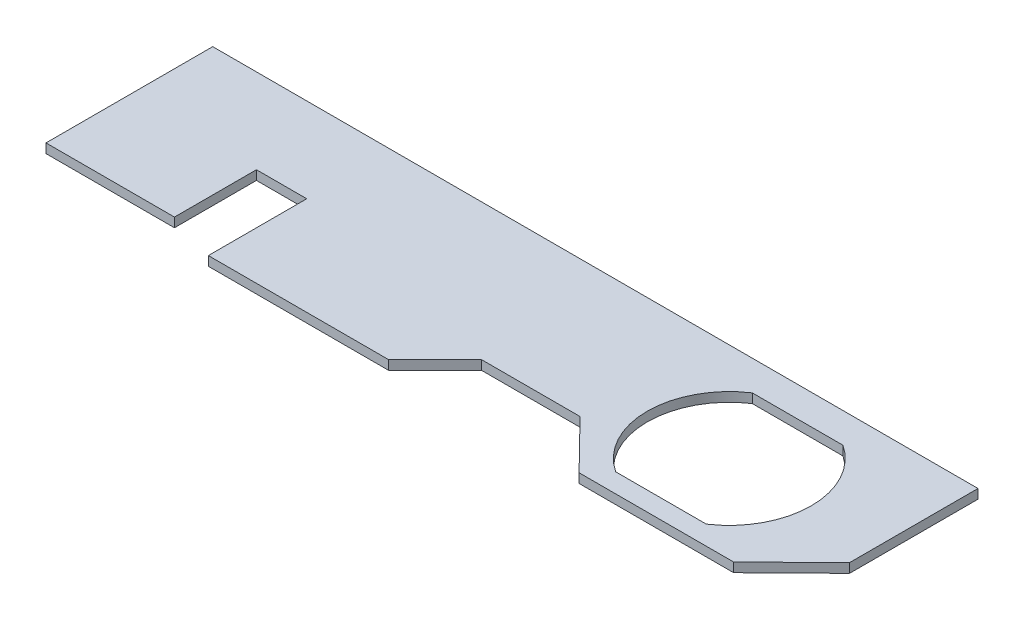
ISO-10303-21;
HEADER;
FILE_DESCRIPTION(('STEP AP214'),'2;1');
FILE_NAME('part.step','',(''),(''),'','','');
FILE_SCHEMA(('AUTOMOTIVE_DESIGN { 1 0 10303 214 1 1 1 1 }'));
ENDSEC;
DATA;
#1=APPLICATION_CONTEXT('core data for automotive mechanical design processes');
#2=APPLICATION_PROTOCOL_DEFINITION('international standard','automotive_design',2000,#1);
#3=PRODUCT_CONTEXT('',#1,'mechanical');
#4=PRODUCT('Part','Part','',(#3));
#5=PRODUCT_RELATED_PRODUCT_CATEGORY('part','',(#4));
#6=PRODUCT_DEFINITION_FORMATION('','',#4);
#7=PRODUCT_DEFINITION_CONTEXT('part definition',#1,'design');
#8=PRODUCT_DEFINITION('design','',#6,#7);
#9=PRODUCT_DEFINITION_SHAPE('','',#8);
#10=(LENGTH_UNIT() NAMED_UNIT(*) SI_UNIT(.MILLI.,.METRE.));
#11=(NAMED_UNIT(*) PLANE_ANGLE_UNIT() SI_UNIT($,.RADIAN.));
#12=(NAMED_UNIT(*) SI_UNIT($,.STERADIAN.) SOLID_ANGLE_UNIT());
#13=UNCERTAINTY_MEASURE_WITH_UNIT(LENGTH_MEASURE(1.E-05),#10,'distance_accuracy_value','');
#14=(GEOMETRIC_REPRESENTATION_CONTEXT(3) GLOBAL_UNCERTAINTY_ASSIGNED_CONTEXT((#13)) GLOBAL_UNIT_ASSIGNED_CONTEXT((#10,
#11,#12)) REPRESENTATION_CONTEXT('',''));
#15=CARTESIAN_POINT('',(0.,0.,0.));
#16=DIRECTION('',(0.,0.,1.));
#17=DIRECTION('',(1.,0.,0.));
#18=AXIS2_PLACEMENT_3D('',#15,#16,#17);
#19=CARTESIAN_POINT('',(-8.01792836277165,1.7,0.));
#20=DIRECTION('',(-1.,0.,0.));
#21=DIRECTION('',(0.,0.,1.));
#22=AXIS2_PLACEMENT_3D('',#19,#20,#21);
#23=PLANE('',#22);
#24=DIRECTION('',(0.,0.,-1.));
#25=VECTOR('',#24,1.);
#26=CARTESIAN_POINT('',(-8.01792836277165,0.,0.));
#27=LINE('',#26,#25);
#28=CARTESIAN_POINT('',(-8.01792836277165,0.,16.5546116504854));
#29=VERTEX_POINT('',#28);
#30=CARTESIAN_POINT('',(-8.01792836277165,0.,1.55461165048544));
#31=VERTEX_POINT('',#30);
#32=EDGE_CURVE('E240',#29,#31,#27,.T.);
#33=ORIENTED_EDGE('',*,*,#32,.T.);
#34=DIRECTION('',(0.,-1.,0.));
#35=VECTOR('',#34,1.);
#36=CARTESIAN_POINT('',(-8.01792836277165,1.7,1.55461165048544));
#37=LINE('',#36,#35);
#38=CARTESIAN_POINT('',(-8.01792836277165,1.7,1.55461165048544));
#39=VERTEX_POINT('',#38);
#40=EDGE_CURVE('E11',#39,#31,#37,.T.);
#41=ORIENTED_EDGE('',*,*,#40,.F.);
#42=DIRECTION('',(0.,0.,-1.));
#43=VECTOR('',#42,1.);
#44=CARTESIAN_POINT('',(-8.01792836277165,1.7,0.));
#45=LINE('',#44,#43);
#46=CARTESIAN_POINT('',(-8.01792836277165,1.7,16.5546116504854));
#47=VERTEX_POINT('',#46);
#48=EDGE_CURVE('E343',#47,#39,#45,.T.);
#49=ORIENTED_EDGE('',*,*,#48,.F.);
#50=DIRECTION('',(0.,-1.,0.));
#51=VECTOR('',#50,1.);
#52=CARTESIAN_POINT('',(-8.01792836277165,1.7,16.5546116504854));
#53=LINE('',#52,#51);
#54=EDGE_CURVE('E276',#47,#29,#53,.T.);
#55=ORIENTED_EDGE('',*,*,#54,.T.);
#56=EDGE_LOOP('',(#33,#41,#49,#55));
#57=FACE_BOUND('',#56,.T.);
#58=ADVANCED_FACE('F43',(#57),#23,.F.);
#59=CARTESIAN_POINT('',(0.,1.7,1.55461165048544));
#60=DIRECTION('',(0.,0.,-1.));
#61=DIRECTION('',(-1.,0.,0.));
#62=AXIS2_PLACEMENT_3D('',#59,#60,#61);
#63=PLANE('',#62);
#64=DIRECTION('',(1.,0.,0.));
#65=VECTOR('',#64,1.);
#66=CARTESIAN_POINT('',(0.,0.,1.55461165048544));
#67=LINE('',#66,#65);
#68=CARTESIAN_POINT('',(1.18207163722835,0.,1.55461165048544));
#69=VERTEX_POINT('',#68);
#70=EDGE_CURVE('E244',#31,#69,#67,.T.);
#71=ORIENTED_EDGE('',*,*,#70,.T.);
#72=DIRECTION('',(0.,-1.,0.));
#73=VECTOR('',#72,1.);
#74=CARTESIAN_POINT('',(1.18207163722835,1.7,1.55461165048544));
#75=LINE('',#74,#73);
#76=CARTESIAN_POINT('',(1.18207163722835,1.7,1.55461165048544));
#77=VERTEX_POINT('',#76);
#78=EDGE_CURVE('E53',#77,#69,#75,.T.);
#79=ORIENTED_EDGE('',*,*,#78,.F.);
#80=DIRECTION('',(1.,0.,0.));
#81=VECTOR('',#80,1.);
#82=CARTESIAN_POINT('',(0.,1.7,1.55461165048544));
#83=LINE('',#82,#81);
#84=EDGE_CURVE('E352',#39,#77,#83,.T.);
#85=ORIENTED_EDGE('',*,*,#84,.F.);
#86=ORIENTED_EDGE('',*,*,#40,.T.);
#87=EDGE_LOOP('',(#71,#79,#85,#86));
#88=FACE_BOUND('',#87,.T.);
#89=ADVANCED_FACE('F402',(#88),#63,.F.);
#90=CARTESIAN_POINT('',(1.18207163722835,1.7,0.));
#91=DIRECTION('',(1.,0.,0.));
#92=DIRECTION('',(0.,0.,-1.));
#93=AXIS2_PLACEMENT_3D('',#90,#91,#92);
#94=PLANE('',#93);
#95=DIRECTION('',(0.,0.,1.));
#96=VECTOR('',#95,1.);
#97=CARTESIAN_POINT('',(1.18207163722835,0.,0.));
#98=LINE('',#97,#96);
#99=CARTESIAN_POINT('',(1.18207163722836,0.,19.5546116504854));
#100=VERTEX_POINT('',#99);
#101=EDGE_CURVE('E246',#69,#100,#98,.T.);
#102=ORIENTED_EDGE('',*,*,#101,.T.);
#103=DIRECTION('',(0.,-1.,0.));
#104=VECTOR('',#103,1.);
#105=CARTESIAN_POINT('',(1.18207163722836,1.7,19.5546116504854));
#106=LINE('',#105,#104);
#107=CARTESIAN_POINT('',(1.18207163722836,1.7,19.5546116504854));
#108=VERTEX_POINT('',#107);
#109=EDGE_CURVE('E306',#108,#100,#106,.T.);
#110=ORIENTED_EDGE('',*,*,#109,.F.);
#111=DIRECTION('',(0.,0.,1.));
#112=VECTOR('',#111,1.);
#113=CARTESIAN_POINT('',(1.18207163722835,1.7,0.));
#114=LINE('',#113,#112);
#115=EDGE_CURVE('E354',#77,#108,#114,.T.);
#116=ORIENTED_EDGE('',*,*,#115,.F.);
#117=ORIENTED_EDGE('',*,*,#78,.T.);
#118=EDGE_LOOP('',(#102,#110,#116,#117));
#119=FACE_BOUND('',#118,.T.);
#120=ADVANCED_FACE('F407',(#119),#94,.F.);
#121=CARTESIAN_POINT('',(0.,1.7,19.5546116504854));
#122=DIRECTION('',(0.,0.,-1.));
#123=DIRECTION('',(-1.,0.,0.));
#124=AXIS2_PLACEMENT_3D('',#121,#122,#123);
#125=PLANE('',#124);
#126=DIRECTION('',(1.,0.,0.));
#127=VECTOR('',#126,1.);
#128=CARTESIAN_POINT('',(0.,0.,19.5546116504854));
#129=LINE('',#128,#127);
#130=CARTESIAN_POINT('',(34.1820716372284,0.,19.5546116504854));
#131=VERTEX_POINT('',#130);
#132=EDGE_CURVE('E249',#100,#131,#129,.T.);
#133=ORIENTED_EDGE('',*,*,#132,.T.);
#134=DIRECTION('',(0.,-1.,0.));
#135=VECTOR('',#134,1.);
#136=CARTESIAN_POINT('',(34.1820716372284,1.7,19.5546116504854));
#137=LINE('',#136,#135);
#138=CARTESIAN_POINT('',(34.1820716372284,1.7,19.5546116504854));
#139=VERTEX_POINT('',#138);
#140=EDGE_CURVE('E302',#139,#131,#137,.T.);
#141=ORIENTED_EDGE('',*,*,#140,.F.);
#142=DIRECTION('',(1.,0.,0.));
#143=VECTOR('',#142,1.);
#144=CARTESIAN_POINT('',(0.,1.7,19.5546116504854));
#145=LINE('',#144,#143);
#146=EDGE_CURVE('E357',#108,#139,#145,.T.);
#147=ORIENTED_EDGE('',*,*,#146,.F.);
#148=ORIENTED_EDGE('',*,*,#109,.T.);
#149=EDGE_LOOP('',(#133,#141,#147,#148));
#150=FACE_BOUND('',#149,.T.);
#151=ADVANCED_FACE('F444',(#150),#125,.F.);
#152=CARTESIAN_POINT('',(26.8683416438569,1.7,26.8683416438569));
#153=DIRECTION('',(-0.707106781186548,0.,-0.707106781186547));
#154=DIRECTION('',(-0.707106781186547,0.,0.707106781186548));
#155=AXIS2_PLACEMENT_3D('',#152,#153,#154);
#156=PLANE('',#155);
#157=DIRECTION('',(0.707106781186547,0.,-0.707106781186548));
#158=VECTOR('',#157,1.);
#159=CARTESIAN_POINT('',(26.8683416438569,0.,26.8683416438569));
#160=LINE('',#159,#158);
#161=CARTESIAN_POINT('',(42.6820716372284,0.,11.0546116504854));
#162=VERTEX_POINT('',#161);
#163=EDGE_CURVE('E252',#131,#162,#160,.T.);
#164=ORIENTED_EDGE('',*,*,#163,.T.);
#165=DIRECTION('',(0.,-1.,0.));
#166=VECTOR('',#165,1.);
#167=CARTESIAN_POINT('',(42.6820716372284,1.7,11.0546116504854));
#168=LINE('',#167,#166);
#169=CARTESIAN_POINT('',(42.6820716372284,1.7,11.0546116504854));
#170=VERTEX_POINT('',#169);
#171=EDGE_CURVE('E298',#170,#162,#168,.T.);
#172=ORIENTED_EDGE('',*,*,#171,.F.);
#173=DIRECTION('',(0.707106781186547,0.,-0.707106781186548));
#174=VECTOR('',#173,1.);
#175=CARTESIAN_POINT('',(26.8683416438569,1.7,26.8683416438569));
#176=LINE('',#175,#174);
#177=EDGE_CURVE('E360',#139,#170,#176,.T.);
#178=ORIENTED_EDGE('',*,*,#177,.F.);
#179=ORIENTED_EDGE('',*,*,#140,.T.);
#180=EDGE_LOOP('',(#164,#172,#178,#179));
#181=FACE_BOUND('',#180,.T.);
#182=ADVANCED_FACE('F440',(#181),#156,.F.);
#183=CARTESIAN_POINT('',(0.,1.7,11.0546116504854));
#184=DIRECTION('',(0.,0.,-1.));
#185=DIRECTION('',(-1.,0.,0.));
#186=AXIS2_PLACEMENT_3D('',#183,#184,#185);
#187=PLANE('',#186);
#188=DIRECTION('',(1.,0.,0.));
#189=VECTOR('',#188,1.);
#190=CARTESIAN_POINT('',(0.,0.,11.0546116504854));
#191=LINE('',#190,#189);
#192=CARTESIAN_POINT('',(60.6820716372284,0.,11.0546116504854));
#193=VERTEX_POINT('',#192);
#194=EDGE_CURVE('E255',#162,#193,#191,.T.);
#195=ORIENTED_EDGE('',*,*,#194,.T.);
#196=DIRECTION('',(0.,-1.,0.));
#197=VECTOR('',#196,1.);
#198=CARTESIAN_POINT('',(60.6820716372284,1.7,11.0546116504854));
#199=LINE('',#198,#197);
#200=CARTESIAN_POINT('',(60.6820716372284,1.7,11.0546116504854));
#201=VERTEX_POINT('',#200);
#202=EDGE_CURVE('E294',#201,#193,#199,.T.);
#203=ORIENTED_EDGE('',*,*,#202,.F.);
#204=DIRECTION('',(1.,0.,0.));
#205=VECTOR('',#204,1.);
#206=CARTESIAN_POINT('',(0.,1.7,11.0546116504854));
#207=LINE('',#206,#205);
#208=EDGE_CURVE('E363',#170,#201,#207,.T.);
#209=ORIENTED_EDGE('',*,*,#208,.F.);
#210=ORIENTED_EDGE('',*,*,#171,.T.);
#211=EDGE_LOOP('',(#195,#203,#209,#210));
#212=FACE_BOUND('',#211,.T.);
#213=ADVANCED_FACE('F436',(#212),#187,.F.);
#214=CARTESIAN_POINT('',(25.421656281477,1.7,-24.9182072957705));
#215=DIRECTION('',(0.714142842854284,0.,-0.700000000000001));
#216=DIRECTION('',(-0.700000000000001,0.,-0.714142842854284));
#217=AXIS2_PLACEMENT_3D('',#214,#215,#216);
#218=PLANE('',#217);
#219=DIRECTION('',(0.700000000000001,0.,0.714142842854284));
#220=VECTOR('',#219,1.);
#221=CARTESIAN_POINT('',(25.421656281477,0.,-24.9182072957705));
#222=LINE('',#221,#220);
#223=CARTESIAN_POINT('',(69.5038361666048,0.,20.0546116504854));
#224=VERTEX_POINT('',#223);
#225=EDGE_CURVE('E258',#193,#224,#222,.T.);
#226=ORIENTED_EDGE('',*,*,#225,.T.);
#227=DIRECTION('',(0.,-1.,0.));
#228=VECTOR('',#227,1.);
#229=CARTESIAN_POINT('',(69.5038361666048,1.7,20.0546116504854));
#230=LINE('',#229,#228);
#231=CARTESIAN_POINT('',(69.5038361666048,1.7,20.0546116504854));
#232=VERTEX_POINT('',#231);
#233=EDGE_CURVE('E290',#232,#224,#230,.T.);
#234=ORIENTED_EDGE('',*,*,#233,.F.);
#235=DIRECTION('',(0.700000000000001,0.,0.714142842854284));
#236=VECTOR('',#235,1.);
#237=CARTESIAN_POINT('',(25.421656281477,1.7,-24.9182072957705));
#238=LINE('',#237,#236);
#239=EDGE_CURVE('E366',#201,#232,#238,.T.);
#240=ORIENTED_EDGE('',*,*,#239,.F.);
#241=ORIENTED_EDGE('',*,*,#202,.T.);
#242=EDGE_LOOP('',(#226,#234,#240,#241));
#243=FACE_BOUND('',#242,.T.);
#244=ADVANCED_FACE('F432',(#243),#218,.F.);
#245=CARTESIAN_POINT('',(0.,1.7,20.0546116504854));
#246=DIRECTION('',(0.,0.,-1.));
#247=DIRECTION('',(-1.,0.,0.));
#248=AXIS2_PLACEMENT_3D('',#245,#246,#247);
#249=PLANE('',#248);
#250=DIRECTION('',(1.,0.,0.));
#251=VECTOR('',#250,1.);
#252=CARTESIAN_POINT('',(0.,0.,20.0546116504854));
#253=LINE('',#252,#251);
#254=CARTESIAN_POINT('',(97.7699289944141,0.,20.0546116504854));
#255=VERTEX_POINT('',#254);
#256=EDGE_CURVE('E261',#224,#255,#253,.T.);
#257=ORIENTED_EDGE('',*,*,#256,.T.);
#258=DIRECTION('',(0.,-1.,0.));
#259=VECTOR('',#258,1.);
#260=CARTESIAN_POINT('',(97.7699289944141,1.7,20.0546116504854));
#261=LINE('',#260,#259);
#262=CARTESIAN_POINT('',(97.7699289944141,1.7,20.0546116504854));
#263=VERTEX_POINT('',#262);
#264=EDGE_CURVE('E286',#263,#255,#261,.T.);
#265=ORIENTED_EDGE('',*,*,#264,.F.);
#266=DIRECTION('',(1.,0.,0.));
#267=VECTOR('',#266,1.);
#268=CARTESIAN_POINT('',(0.,1.7,20.0546116504854));
#269=LINE('',#268,#267);
#270=EDGE_CURVE('E369',#232,#263,#269,.T.);
#271=ORIENTED_EDGE('',*,*,#270,.F.);
#272=ORIENTED_EDGE('',*,*,#233,.T.);
#273=EDGE_LOOP('',(#257,#265,#271,#272));
#274=FACE_BOUND('',#273,.T.);
#275=ADVANCED_FACE('F429',(#274),#249,.F.);
#276=CARTESIAN_POINT('',(57.9325653707544,1.7,59.1030384681603));
#277=DIRECTION('',(-0.7,0.,-0.714142842854285));
#278=DIRECTION('',(-0.714142842854285,0.,0.7));
#279=AXIS2_PLACEMENT_3D('',#276,#277,#278);
#280=PLANE('',#279);
#281=DIRECTION('',(0.714142842854285,0.,-0.700000000000001));
#282=VECTOR('',#281,1.);
#283=CARTESIAN_POINT('',(57.9325653707544,0.,59.1030384681603));
#284=LINE('',#283,#282);
#285=CARTESIAN_POINT('',(108.482071637228,0.,9.55461165048542));
#286=VERTEX_POINT('',#285);
#287=EDGE_CURVE('E264',#255,#286,#284,.T.);
#288=ORIENTED_EDGE('',*,*,#287,.T.);
#289=DIRECTION('',(0.,-1.,0.));
#290=VECTOR('',#289,1.);
#291=CARTESIAN_POINT('',(108.482071637228,1.7,9.55461165048542));
#292=LINE('',#291,#290);
#293=CARTESIAN_POINT('',(108.482071637228,1.7,9.55461165048542));
#294=VERTEX_POINT('',#293);
#295=EDGE_CURVE('E282',#294,#286,#292,.T.);
#296=ORIENTED_EDGE('',*,*,#295,.F.);
#297=DIRECTION('',(0.714142842854285,0.,-0.700000000000001));
#298=VECTOR('',#297,1.);
#299=CARTESIAN_POINT('',(57.9325653707544,1.7,59.1030384681603));
#300=LINE('',#299,#298);
#301=EDGE_CURVE('E372',#263,#294,#300,.T.);
#302=ORIENTED_EDGE('',*,*,#301,.F.);
#303=ORIENTED_EDGE('',*,*,#264,.T.);
#304=EDGE_LOOP('',(#288,#296,#302,#303));
#305=FACE_BOUND('',#304,.T.);
#306=ADVANCED_FACE('F380',(#305),#280,.F.);
#307=CARTESIAN_POINT('',(108.482071637228,1.7,0.));
#308=DIRECTION('',(-1.,0.,0.));
#309=DIRECTION('',(0.,0.,1.));
#310=AXIS2_PLACEMENT_3D('',#307,#308,#309);
#311=PLANE('',#310);
#312=DIRECTION('',(0.,0.,-1.));
#313=VECTOR('',#312,1.);
#314=CARTESIAN_POINT('',(108.482071637228,0.,0.));
#315=LINE('',#314,#313);
#316=CARTESIAN_POINT('',(108.482071637228,0.,-13.9453883495146));
#317=VERTEX_POINT('',#316);
#318=EDGE_CURVE('E267',#286,#317,#315,.T.);
#319=ORIENTED_EDGE('',*,*,#318,.T.);
#320=DIRECTION('',(0.,-1.,0.));
#321=VECTOR('',#320,1.);
#322=CARTESIAN_POINT('',(108.482071637228,1.7,-13.9453883495146));
#323=LINE('',#322,#321);
#324=CARTESIAN_POINT('',(108.482071637228,1.7,-13.9453883495146));
#325=VERTEX_POINT('',#324);
#326=EDGE_CURVE('E214',#325,#317,#323,.T.);
#327=ORIENTED_EDGE('',*,*,#326,.F.);
#328=DIRECTION('',(0.,0.,-1.));
#329=VECTOR('',#328,1.);
#330=CARTESIAN_POINT('',(108.482071637228,1.7,0.));
#331=LINE('',#330,#329);
#332=EDGE_CURVE('E204',#294,#325,#331,.T.);
#333=ORIENTED_EDGE('',*,*,#332,.F.);
#334=ORIENTED_EDGE('',*,*,#295,.T.);
#335=EDGE_LOOP('',(#319,#327,#333,#334));
#336=FACE_BOUND('',#335,.T.);
#337=ADVANCED_FACE('F384',(#336),#311,.F.);
#338=CARTESIAN_POINT('',(0.,1.7,-13.9453883495146));
#339=DIRECTION('',(0.,0.,1.));
#340=DIRECTION('',(1.,0.,0.));
#341=AXIS2_PLACEMENT_3D('',#338,#339,#340);
#342=PLANE('',#341);
#343=DIRECTION('',(-1.,0.,0.));
#344=VECTOR('',#343,1.);
#345=CARTESIAN_POINT('',(0.,0.,-13.9453883495146));
#346=LINE('',#345,#344);
#347=CARTESIAN_POINT('',(-31.5179283627717,0.,-13.9453883495146));
#348=VERTEX_POINT('',#347);
#349=EDGE_CURVE('E213',#317,#348,#346,.T.);
#350=ORIENTED_EDGE('',*,*,#349,.T.);
#351=DIRECTION('',(0.,-1.,0.));
#352=VECTOR('',#351,1.);
#353=CARTESIAN_POINT('',(-31.5179283627717,1.7,-13.9453883495146));
#354=LINE('',#353,#352);
#355=CARTESIAN_POINT('',(-31.5179283627717,1.7,-13.9453883495146));
#356=VERTEX_POINT('',#355);
#357=EDGE_CURVE('E210',#356,#348,#354,.T.);
#358=ORIENTED_EDGE('',*,*,#357,.F.);
#359=DIRECTION('',(-1.,0.,0.));
#360=VECTOR('',#359,1.);
#361=CARTESIAN_POINT('',(0.,1.7,-13.9453883495146));
#362=LINE('',#361,#360);
#363=EDGE_CURVE('E198',#325,#356,#362,.T.);
#364=ORIENTED_EDGE('',*,*,#363,.F.);
#365=ORIENTED_EDGE('',*,*,#326,.T.);
#366=EDGE_LOOP('',(#350,#358,#364,#365));
#367=FACE_BOUND('',#366,.T.);
#368=ADVANCED_FACE('F211',(#367),#342,.F.);
#369=CARTESIAN_POINT('',(-31.5179283627717,1.7,0.));
#370=DIRECTION('',(1.,0.,0.));
#371=DIRECTION('',(0.,0.,-1.));
#372=AXIS2_PLACEMENT_3D('',#369,#370,#371);
#373=PLANE('',#372);
#374=DIRECTION('',(0.,0.,1.));
#375=VECTOR('',#374,1.);
#376=CARTESIAN_POINT('',(-31.5179283627717,0.,0.));
#377=LINE('',#376,#375);
#378=CARTESIAN_POINT('',(-31.5179283627716,0.,16.5546116504854));
#379=VERTEX_POINT('',#378);
#380=EDGE_CURVE('E131',#348,#379,#377,.T.);
#381=ORIENTED_EDGE('',*,*,#380,.T.);
#382=DIRECTION('',(0.,-1.,0.));
#383=VECTOR('',#382,1.);
#384=CARTESIAN_POINT('',(-31.5179283627716,1.7,16.5546116504854));
#385=LINE('',#384,#383);
#386=CARTESIAN_POINT('',(-31.5179283627716,1.7,16.5546116504854));
#387=VERTEX_POINT('',#386);
#388=EDGE_CURVE('E215',#387,#379,#385,.T.);
#389=ORIENTED_EDGE('',*,*,#388,.F.);
#390=DIRECTION('',(0.,0.,1.));
#391=VECTOR('',#390,1.);
#392=CARTESIAN_POINT('',(-31.5179283627717,1.7,0.));
#393=LINE('',#392,#391);
#394=EDGE_CURVE('E202',#356,#387,#393,.T.);
#395=ORIENTED_EDGE('',*,*,#394,.F.);
#396=ORIENTED_EDGE('',*,*,#357,.T.);
#397=EDGE_LOOP('',(#381,#389,#395,#396));
#398=FACE_BOUND('',#397,.T.);
#399=ADVANCED_FACE('F217',(#398),#373,.F.);
#400=CARTESIAN_POINT('',(80.9820716372284,1.7,4.05461165048542));
#401=DIRECTION('',(0.,-1.,0.));
#402=DIRECTION('',(0.,0.,-1.));
#403=AXIS2_PLACEMENT_3D('',#400,#401,#402);
#404=CYLINDRICAL_SURFACE('',#403,15.);
#405=CARTESIAN_POINT('',(80.9820716372284,0.,4.05461165048542));
#406=DIRECTION('',(0.,1.,0.));
#407=DIRECTION('',(0.,0.,1.));
#408=AXIS2_PLACEMENT_3D('',#405,#406,#407);
#409=CIRCLE('',#408,15.);
#410=CARTESIAN_POINT('',(72.6905096613399,0.,-8.44538834951458));
#411=VERTEX_POINT('',#410);
#412=CARTESIAN_POINT('',(72.6905096613399,0.,16.5546116504854));
#413=VERTEX_POINT('',#412);
#414=EDGE_CURVE('E224',#411,#413,#409,.T.);
#415=ORIENTED_EDGE('',*,*,#414,.F.);
#416=DIRECTION('',(0.,-1.,0.));
#417=VECTOR('',#416,1.);
#418=CARTESIAN_POINT('',(72.6905096613399,1.7,-8.44538834951458));
#419=LINE('',#418,#417);
#420=CARTESIAN_POINT('',(72.6905096613399,1.7,-8.44538834951458));
#421=VERTEX_POINT('',#420);
#422=EDGE_CURVE('E47',#421,#411,#419,.T.);
#423=ORIENTED_EDGE('',*,*,#422,.F.);
#424=CARTESIAN_POINT('',(80.9820716372284,1.7,4.05461165048542));
#425=DIRECTION('',(0.,1.,0.));
#426=DIRECTION('',(0.,0.,1.));
#427=AXIS2_PLACEMENT_3D('',#424,#425,#426);
#428=CIRCLE('',#427,15.);
#429=CARTESIAN_POINT('',(72.6905096613399,1.7,16.5546116504854));
#430=VERTEX_POINT('',#429);
#431=EDGE_CURVE('E275',#421,#430,#428,.T.);
#432=ORIENTED_EDGE('',*,*,#431,.T.);
#433=DIRECTION('',(0.,-1.,0.));
#434=VECTOR('',#433,1.);
#435=CARTESIAN_POINT('',(72.6905096613399,1.7,16.5546116504854));
#436=LINE('',#435,#434);
#437=EDGE_CURVE('E220',#430,#413,#436,.T.);
#438=ORIENTED_EDGE('',*,*,#437,.T.);
#439=EDGE_LOOP('',(#415,#423,#432,#438));
#440=FACE_BOUND('',#439,.T.);
#441=ADVANCED_FACE('F45',(#440),#404,.F.);
#442=CARTESIAN_POINT('',(0.,1.7,-8.44538834951457));
#443=DIRECTION('',(0.,0.,1.));
#444=DIRECTION('',(1.,0.,0.));
#445=AXIS2_PLACEMENT_3D('',#442,#443,#444);
#446=PLANE('',#445);
#447=DIRECTION('',(-1.,0.,0.));
#448=VECTOR('',#447,1.);
#449=CARTESIAN_POINT('',(0.,0.,-8.44538834951457));
#450=LINE('',#449,#448);
#451=CARTESIAN_POINT('',(89.2736336131169,0.,-8.44538834951459));
#452=VERTEX_POINT('',#451);
#453=EDGE_CURVE('E228',#452,#411,#450,.T.);
#454=ORIENTED_EDGE('',*,*,#453,.F.);
#455=DIRECTION('',(0.,-1.,0.));
#456=VECTOR('',#455,1.);
#457=CARTESIAN_POINT('',(89.2736336131169,1.7,-8.44538834951459));
#458=LINE('',#457,#456);
#459=CARTESIAN_POINT('',(89.2736336131169,1.7,-8.44538834951459));
#460=VERTEX_POINT('',#459);
#461=EDGE_CURVE('E316',#460,#452,#458,.T.);
#462=ORIENTED_EDGE('',*,*,#461,.F.);
#463=DIRECTION('',(-1.,0.,0.));
#464=VECTOR('',#463,1.);
#465=CARTESIAN_POINT('',(0.,1.7,-8.44538834951457));
#466=LINE('',#465,#464);
#467=EDGE_CURVE('E328',#460,#421,#466,.T.);
#468=ORIENTED_EDGE('',*,*,#467,.T.);
#469=ORIENTED_EDGE('',*,*,#422,.T.);
#470=EDGE_LOOP('',(#454,#462,#468,#469));
#471=FACE_BOUND('',#470,.T.);
#472=ADVANCED_FACE('F326',(#471),#446,.T.);
#473=CARTESIAN_POINT('',(80.9820716372284,1.7,4.05461165048542));
#474=DIRECTION('',(0.,-1.,0.));
#475=DIRECTION('',(0.,0.,-1.));
#476=AXIS2_PLACEMENT_3D('',#473,#474,#475);
#477=CYLINDRICAL_SURFACE('',#476,15.);
#478=CARTESIAN_POINT('',(80.9820716372284,0.,4.05461165048542));
#479=DIRECTION('',(0.,1.,0.));
#480=DIRECTION('',(0.,0.,1.));
#481=AXIS2_PLACEMENT_3D('',#478,#479,#480);
#482=CIRCLE('',#481,15.);
#483=CARTESIAN_POINT('',(89.2736336131168,0.,16.5546116504854));
#484=VERTEX_POINT('',#483);
#485=EDGE_CURVE('E232',#484,#452,#482,.T.);
#486=ORIENTED_EDGE('',*,*,#485,.F.);
#487=DIRECTION('',(0.,-1.,0.));
#488=VECTOR('',#487,1.);
#489=CARTESIAN_POINT('',(89.2736336131168,1.7,16.5546116504854));
#490=LINE('',#489,#488);
#491=CARTESIAN_POINT('',(89.2736336131168,1.7,16.5546116504854));
#492=VERTEX_POINT('',#491);
#493=EDGE_CURVE('E314',#492,#484,#490,.T.);
#494=ORIENTED_EDGE('',*,*,#493,.F.);
#495=CARTESIAN_POINT('',(80.9820716372284,1.7,4.05461165048542));
#496=DIRECTION('',(0.,1.,0.));
#497=DIRECTION('',(0.,0.,1.));
#498=AXIS2_PLACEMENT_3D('',#495,#496,#497);
#499=CIRCLE('',#498,15.);
#500=EDGE_CURVE('E337',#492,#460,#499,.T.);
#501=ORIENTED_EDGE('',*,*,#500,.T.);
#502=ORIENTED_EDGE('',*,*,#461,.T.);
#503=EDGE_LOOP('',(#486,#494,#501,#502));
#504=FACE_BOUND('',#503,.T.);
#505=ADVANCED_FACE('F334',(#504),#477,.F.);
#506=CARTESIAN_POINT('',(0.,1.7,16.5546116504854));
#507=DIRECTION('',(0.,0.,1.));
#508=DIRECTION('',(1.,0.,0.));
#509=AXIS2_PLACEMENT_3D('',#506,#507,#508);
#510=PLANE('',#509);
#511=DIRECTION('',(-1.,0.,0.));
#512=VECTOR('',#511,1.);
#513=CARTESIAN_POINT('',(0.,0.,16.5546116504854));
#514=LINE('',#513,#512);
#515=EDGE_CURVE('E236',#484,#413,#514,.T.);
#516=ORIENTED_EDGE('',*,*,#515,.T.);
#517=ORIENTED_EDGE('',*,*,#437,.F.);
#518=DIRECTION('',(-1.,0.,0.));
#519=VECTOR('',#518,1.);
#520=CARTESIAN_POINT('',(0.,1.7,16.5546116504854));
#521=LINE('',#520,#519);
#522=EDGE_CURVE('E339',#492,#430,#521,.T.);
#523=ORIENTED_EDGE('',*,*,#522,.F.);
#524=ORIENTED_EDGE('',*,*,#493,.T.);
#525=EDGE_LOOP('',(#516,#517,#523,#524));
#526=FACE_BOUND('',#525,.T.);
#527=ADVANCED_FACE('F340',(#526),#510,.F.);
#528=CARTESIAN_POINT('',(0.,1.7,16.5546116504854));
#529=DIRECTION('',(0.,0.,-1.));
#530=DIRECTION('',(-1.,0.,0.));
#531=AXIS2_PLACEMENT_3D('',#528,#529,#530);
#532=PLANE('',#531);
#533=DIRECTION('',(1.,0.,0.));
#534=VECTOR('',#533,1.);
#535=CARTESIAN_POINT('',(0.,0.,16.5546116504854));
#536=LINE('',#535,#534);
#537=EDGE_CURVE('E139',#379,#29,#536,.T.);
#538=ORIENTED_EDGE('',*,*,#537,.T.);
#539=ORIENTED_EDGE('',*,*,#54,.F.);
#540=DIRECTION('',(1.,0.,0.));
#541=VECTOR('',#540,1.);
#542=CARTESIAN_POINT('',(0.,1.7,16.5546116504854));
#543=LINE('',#542,#541);
#544=EDGE_CURVE('E65',#387,#47,#543,.T.);
#545=ORIENTED_EDGE('',*,*,#544,.F.);
#546=ORIENTED_EDGE('',*,*,#388,.T.);
#547=EDGE_LOOP('',(#538,#539,#545,#546));
#548=FACE_BOUND('',#547,.T.);
#549=ADVANCED_FACE('F390',(#548),#532,.F.);
#550=CARTESIAN_POINT('',(0.,1.7,0.));
#551=DIRECTION('',(0.,1.,0.));
#552=DIRECTION('',(0.,0.,1.));
#553=AXIS2_PLACEMENT_3D('',#550,#551,#552);
#554=PLANE('',#553);
#555=ORIENTED_EDGE('',*,*,#431,.F.);
#556=ORIENTED_EDGE('',*,*,#467,.F.);
#557=ORIENTED_EDGE('',*,*,#500,.F.);
#558=ORIENTED_EDGE('',*,*,#522,.T.);
#559=EDGE_LOOP('',(#555,#556,#557,#558));
#560=FACE_BOUND('',#559,.T.);
#561=ORIENTED_EDGE('',*,*,#48,.T.);
#562=ORIENTED_EDGE('',*,*,#84,.T.);
#563=ORIENTED_EDGE('',*,*,#115,.T.);
#564=ORIENTED_EDGE('',*,*,#146,.T.);
#565=ORIENTED_EDGE('',*,*,#177,.T.);
#566=ORIENTED_EDGE('',*,*,#208,.T.);
#567=ORIENTED_EDGE('',*,*,#239,.T.);
#568=ORIENTED_EDGE('',*,*,#270,.T.);
#569=ORIENTED_EDGE('',*,*,#301,.T.);
#570=ORIENTED_EDGE('',*,*,#332,.T.);
#571=ORIENTED_EDGE('',*,*,#363,.T.);
#572=ORIENTED_EDGE('',*,*,#394,.T.);
#573=ORIENTED_EDGE('',*,*,#544,.T.);
#574=EDGE_LOOP('',(#561,#562,#563,#564,#565,#566,#567,#568,#569,#570,#571,#572,#573));
#575=FACE_BOUND('',#574,.T.);
#576=ADVANCED_FACE('F200',(#560,#575),#554,.T.);
#577=CARTESIAN_POINT('',(0.,0.,0.));
#578=DIRECTION('',(0.,1.,0.));
#579=DIRECTION('',(0.,0.,1.));
#580=AXIS2_PLACEMENT_3D('',#577,#578,#579);
#581=PLANE('',#580);
#582=ORIENTED_EDGE('',*,*,#414,.T.);
#583=ORIENTED_EDGE('',*,*,#515,.F.);
#584=ORIENTED_EDGE('',*,*,#485,.T.);
#585=ORIENTED_EDGE('',*,*,#453,.T.);
#586=EDGE_LOOP('',(#582,#583,#584,#585));
#587=FACE_BOUND('',#586,.T.);
#588=ORIENTED_EDGE('',*,*,#32,.F.);
#589=ORIENTED_EDGE('',*,*,#537,.F.);
#590=ORIENTED_EDGE('',*,*,#380,.F.);
#591=ORIENTED_EDGE('',*,*,#349,.F.);
#592=ORIENTED_EDGE('',*,*,#318,.F.);
#593=ORIENTED_EDGE('',*,*,#287,.F.);
#594=ORIENTED_EDGE('',*,*,#256,.F.);
#595=ORIENTED_EDGE('',*,*,#225,.F.);
#596=ORIENTED_EDGE('',*,*,#194,.F.);
#597=ORIENTED_EDGE('',*,*,#163,.F.);
#598=ORIENTED_EDGE('',*,*,#132,.F.);
#599=ORIENTED_EDGE('',*,*,#101,.F.);
#600=ORIENTED_EDGE('',*,*,#70,.F.);
#601=EDGE_LOOP('',(#588,#589,#590,#591,#592,#593,#594,#595,#596,#597,#598,#599,#600));
#602=FACE_BOUND('',#601,.T.);
#603=ADVANCED_FACE('F332',(#587,#602),#581,.F.);
#604=CLOSED_SHELL('',(#58,#89,#120,#151,#182,#213,#244,#275,#306,#337,#368,#399,#441,#472,#505,
#527,#549,#576,#603));
#605=MANIFOLD_SOLID_BREP('B2',#604);
#606=ADVANCED_BREP_SHAPE_REPRESENTATION('',(#18,#605),#14);
#607=SHAPE_DEFINITION_REPRESENTATION(#9,#606);
ENDSEC;
END-ISO-10303-21;
